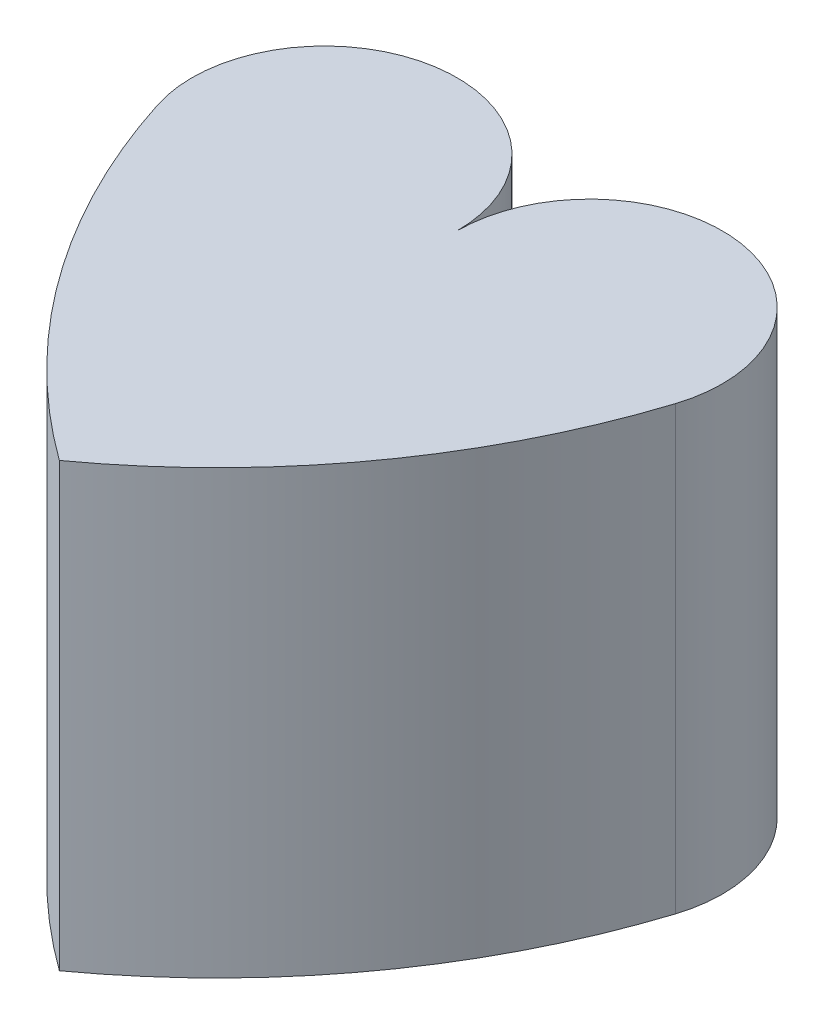
ISO-10303-21;
HEADER;
FILE_DESCRIPTION(('STEP AP214'),'2;1');
FILE_NAME('part.step','',(''),(''),'','','');
FILE_SCHEMA(('AUTOMOTIVE_DESIGN { 1 0 10303 214 1 1 1 1 }'));
ENDSEC;
DATA;
#1=APPLICATION_CONTEXT('core data for automotive mechanical design processes');
#2=APPLICATION_PROTOCOL_DEFINITION('international standard','automotive_design',2000,#1);
#3=PRODUCT_CONTEXT('',#1,'mechanical');
#4=PRODUCT('Part','Part','',(#3));
#5=PRODUCT_RELATED_PRODUCT_CATEGORY('part','',(#4));
#6=PRODUCT_DEFINITION_FORMATION('','',#4);
#7=PRODUCT_DEFINITION_CONTEXT('part definition',#1,'design');
#8=PRODUCT_DEFINITION('design','',#6,#7);
#9=PRODUCT_DEFINITION_SHAPE('','',#8);
#10=(LENGTH_UNIT() NAMED_UNIT(*) SI_UNIT(.MILLI.,.METRE.));
#11=(NAMED_UNIT(*) PLANE_ANGLE_UNIT() SI_UNIT($,.RADIAN.));
#12=(NAMED_UNIT(*) SI_UNIT($,.STERADIAN.) SOLID_ANGLE_UNIT());
#13=UNCERTAINTY_MEASURE_WITH_UNIT(LENGTH_MEASURE(1.E-05),#10,'distance_accuracy_value','');
#14=(GEOMETRIC_REPRESENTATION_CONTEXT(3) GLOBAL_UNCERTAINTY_ASSIGNED_CONTEXT((#13)) GLOBAL_UNIT_ASSIGNED_CONTEXT((#10,
#11,#12)) REPRESENTATION_CONTEXT('',''));
#15=CARTESIAN_POINT('',(0.,0.,0.));
#16=DIRECTION('',(0.,0.,1.));
#17=DIRECTION('',(1.,0.,0.));
#18=AXIS2_PLACEMENT_3D('',#15,#16,#17);
#19=CARTESIAN_POINT('',(-4.69098532272012,2.5,-3.48032844090671));
#20=DIRECTION('',(0.,-1.,0.));
#21=DIRECTION('',(0.,0.,-1.));
#22=AXIS2_PLACEMENT_3D('',#19,#20,#21);
#23=CYLINDRICAL_SURFACE('',#22,8.00000000000001);
#24=CARTESIAN_POINT('',(-4.69098532272012,-2.5,-3.48032844090671));
#25=DIRECTION('',(0.,1.,0.));
#26=DIRECTION('',(0.,0.,-1.));
#27=AXIS2_PLACEMENT_3D('',#24,#25,#26);
#28=CIRCLE('',#27,8.00000000000001);
#29=CARTESIAN_POINT('',(0.,-2.5,3.00000000000001));
#30=VERTEX_POINT('',#29);
#31=CARTESIAN_POINT('',(2.92868892062772,-2.5,-1.04300112902153));
#32=VERTEX_POINT('',#31);
#33=EDGE_CURVE('E96',#30,#32,#28,.T.);
#34=ORIENTED_EDGE('',*,*,#33,.T.);
#35=DIRECTION('',(0.,-1.,0.));
#36=VECTOR('',#35,1.);
#37=CARTESIAN_POINT('',(2.92868892062772,2.5,-1.04300112902153));
#38=LINE('',#37,#36);
#39=CARTESIAN_POINT('',(2.92868892062772,2.5,-1.04300112902153));
#40=VERTEX_POINT('',#39);
#41=EDGE_CURVE('E11',#40,#32,#38,.T.);
#42=ORIENTED_EDGE('',*,*,#41,.F.);
#43=CARTESIAN_POINT('',(-4.69098532272012,2.5,-3.48032844090671));
#44=DIRECTION('',(0.,1.,0.));
#45=DIRECTION('',(0.,0.,-1.));
#46=AXIS2_PLACEMENT_3D('',#43,#44,#45);
#47=CIRCLE('',#46,8.00000000000001);
#48=CARTESIAN_POINT('',(0.,2.5,3.00000000000001));
#49=VERTEX_POINT('',#48);
#50=EDGE_CURVE('E84',#49,#40,#47,.T.);
#51=ORIENTED_EDGE('',*,*,#50,.F.);
#52=DIRECTION('',(0.,-1.,0.));
#53=VECTOR('',#52,1.);
#54=CARTESIAN_POINT('',(0.,2.5,3.00000000000001));
#55=LINE('',#54,#53);
#56=EDGE_CURVE('E92',#49,#30,#55,.T.);
#57=ORIENTED_EDGE('',*,*,#56,.T.);
#58=EDGE_LOOP('',(#34,#42,#51,#57));
#59=FACE_BOUND('',#58,.T.);
#60=ADVANCED_FACE('F33',(#59),#23,.T.);
#61=CARTESIAN_POINT('',(1.5,2.5,-1.5));
#62=DIRECTION('',(0.,-1.,0.));
#63=DIRECTION('',(0.,0.,-1.));
#64=AXIS2_PLACEMENT_3D('',#61,#62,#63);
#65=CYLINDRICAL_SURFACE('',#64,1.5);
#66=CARTESIAN_POINT('',(1.5,-2.5,-1.5));
#67=DIRECTION('',(0.,1.,0.));
#68=DIRECTION('',(0.,0.,1.));
#69=AXIS2_PLACEMENT_3D('',#66,#67,#68);
#70=CIRCLE('',#69,1.5);
#71=CARTESIAN_POINT('',(0.,-2.5,-1.5));
#72=VERTEX_POINT('',#71);
#73=EDGE_CURVE('E88',#32,#72,#70,.T.);
#74=ORIENTED_EDGE('',*,*,#73,.T.);
#75=DIRECTION('',(0.,-1.,0.));
#76=VECTOR('',#75,1.);
#77=CARTESIAN_POINT('',(0.,2.5,-1.5));
#78=LINE('',#77,#76);
#79=CARTESIAN_POINT('',(0.,2.5,-1.5));
#80=VERTEX_POINT('',#79);
#81=EDGE_CURVE('E41',#80,#72,#78,.T.);
#82=ORIENTED_EDGE('',*,*,#81,.F.);
#83=CARTESIAN_POINT('',(1.5,2.5,-1.5));
#84=DIRECTION('',(0.,1.,0.));
#85=DIRECTION('',(0.,0.,1.));
#86=AXIS2_PLACEMENT_3D('',#83,#84,#85);
#87=CIRCLE('',#86,1.5);
#88=EDGE_CURVE('E79',#40,#80,#87,.T.);
#89=ORIENTED_EDGE('',*,*,#88,.F.);
#90=ORIENTED_EDGE('',*,*,#41,.T.);
#91=EDGE_LOOP('',(#74,#82,#89,#90));
#92=FACE_BOUND('',#91,.T.);
#93=ADVANCED_FACE('F87',(#92),#65,.T.);
#94=CARTESIAN_POINT('',(-1.49999999999999,2.5,-1.5));
#95=DIRECTION('',(0.,-1.,0.));
#96=DIRECTION('',(0.,0.,-1.));
#97=AXIS2_PLACEMENT_3D('',#94,#95,#96);
#98=CYLINDRICAL_SURFACE('',#97,1.5);
#99=CARTESIAN_POINT('',(-1.49999999999999,-2.5,-1.5));
#100=DIRECTION('',(0.,1.,0.));
#101=DIRECTION('',(0.,0.,1.));
#102=AXIS2_PLACEMENT_3D('',#99,#100,#101);
#103=CIRCLE('',#102,1.5);
#104=CARTESIAN_POINT('',(-2.92868892062771,-2.5,-1.04300112902153));
#105=VERTEX_POINT('',#104);
#106=EDGE_CURVE('E66',#72,#105,#103,.T.);
#107=ORIENTED_EDGE('',*,*,#106,.T.);
#108=DIRECTION('',(0.,-1.,0.));
#109=VECTOR('',#108,1.);
#110=CARTESIAN_POINT('',(-2.92868892062771,2.5,-1.04300112902153));
#111=LINE('',#110,#109);
#112=CARTESIAN_POINT('',(-2.92868892062771,2.5,-1.04300112902153));
#113=VERTEX_POINT('',#112);
#114=EDGE_CURVE('E89',#113,#105,#111,.T.);
#115=ORIENTED_EDGE('',*,*,#114,.F.);
#116=CARTESIAN_POINT('',(-1.49999999999999,2.5,-1.5));
#117=DIRECTION('',(0.,1.,0.));
#118=DIRECTION('',(0.,0.,1.));
#119=AXIS2_PLACEMENT_3D('',#116,#117,#118);
#120=CIRCLE('',#119,1.5);
#121=EDGE_CURVE('E82',#80,#113,#120,.T.);
#122=ORIENTED_EDGE('',*,*,#121,.F.);
#123=ORIENTED_EDGE('',*,*,#81,.T.);
#124=EDGE_LOOP('',(#107,#115,#122,#123));
#125=FACE_BOUND('',#124,.T.);
#126=ADVANCED_FACE('F90',(#125),#98,.T.);
#127=CARTESIAN_POINT('',(4.69098532272012,2.5,-3.48032844090671));
#128=DIRECTION('',(0.,-1.,0.));
#129=DIRECTION('',(0.,0.,-1.));
#130=AXIS2_PLACEMENT_3D('',#127,#128,#129);
#131=CYLINDRICAL_SURFACE('',#130,7.99999999999999);
#132=CARTESIAN_POINT('',(4.69098532272012,-2.5,-3.48032844090671));
#133=DIRECTION('',(0.,1.,0.));
#134=DIRECTION('',(0.,0.,1.));
#135=AXIS2_PLACEMENT_3D('',#132,#133,#134);
#136=CIRCLE('',#135,7.99999999999999);
#137=EDGE_CURVE('E72',#105,#30,#136,.T.);
#138=ORIENTED_EDGE('',*,*,#137,.T.);
#139=ORIENTED_EDGE('',*,*,#56,.F.);
#140=CARTESIAN_POINT('',(4.69098532272012,2.5,-3.48032844090671));
#141=DIRECTION('',(0.,1.,0.));
#142=DIRECTION('',(0.,0.,1.));
#143=AXIS2_PLACEMENT_3D('',#140,#141,#142);
#144=CIRCLE('',#143,7.99999999999999);
#145=EDGE_CURVE('E49',#113,#49,#144,.T.);
#146=ORIENTED_EDGE('',*,*,#145,.F.);
#147=ORIENTED_EDGE('',*,*,#114,.T.);
#148=EDGE_LOOP('',(#138,#139,#146,#147));
#149=FACE_BOUND('',#148,.T.);
#150=ADVANCED_FACE('F103',(#149),#131,.T.);
#151=CARTESIAN_POINT('',(0.,2.5,-3.48032844090671));
#152=DIRECTION('',(0.,-1.,0.));
#153=DIRECTION('',(0.,0.,-1.));
#154=AXIS2_PLACEMENT_3D('',#151,#152,#153);
#155=PLANE('',#154);
#156=ORIENTED_EDGE('',*,*,#50,.T.);
#157=ORIENTED_EDGE('',*,*,#88,.T.);
#158=ORIENTED_EDGE('',*,*,#121,.T.);
#159=ORIENTED_EDGE('',*,*,#145,.T.);
#160=EDGE_LOOP('',(#156,#157,#158,#159));
#161=FACE_BOUND('',#160,.T.);
#162=ADVANCED_FACE('F80',(#161),#155,.F.);
#163=CARTESIAN_POINT('',(0.,-2.5,-3.48032844090671));
#164=DIRECTION('',(0.,-1.,0.));
#165=DIRECTION('',(0.,0.,-1.));
#166=AXIS2_PLACEMENT_3D('',#163,#164,#165);
#167=PLANE('',#166);
#168=ORIENTED_EDGE('',*,*,#33,.F.);
#169=ORIENTED_EDGE('',*,*,#137,.F.);
#170=ORIENTED_EDGE('',*,*,#106,.F.);
#171=ORIENTED_EDGE('',*,*,#73,.F.);
#172=EDGE_LOOP('',(#168,#169,#170,#171));
#173=FACE_BOUND('',#172,.T.);
#174=ADVANCED_FACE('F106',(#173),#167,.T.);
#175=CLOSED_SHELL('',(#60,#93,#126,#150,#162,#174));
#176=MANIFOLD_SOLID_BREP('B2',#175);
#177=ADVANCED_BREP_SHAPE_REPRESENTATION('',(#18,#176),#14);
#178=SHAPE_DEFINITION_REPRESENTATION(#9,#177);
ENDSEC;
END-ISO-10303-21;
